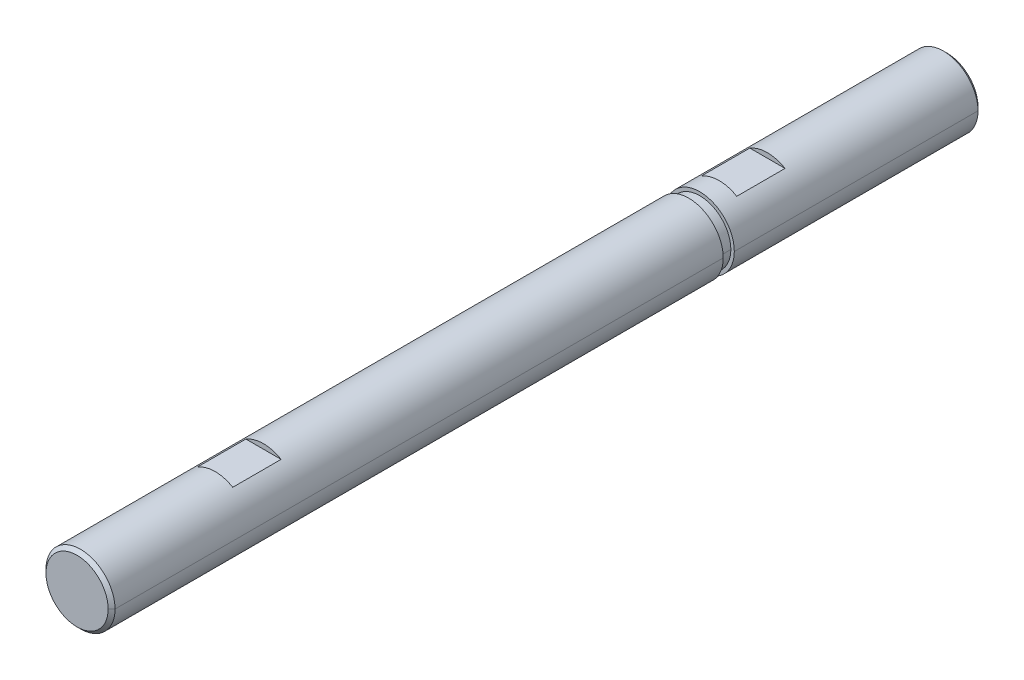
ISO-10303-21;
HEADER;
FILE_DESCRIPTION(('STEP AP214'),'2;1');
FILE_NAME('part.step','',(''),(''),'','','');
FILE_SCHEMA(('AUTOMOTIVE_DESIGN { 1 0 10303 214 1 1 1 1 }'));
ENDSEC;
DATA;
#1=APPLICATION_CONTEXT('core data for automotive mechanical design processes');
#2=APPLICATION_PROTOCOL_DEFINITION('international standard','automotive_design',2000,#1);
#3=PRODUCT_CONTEXT('',#1,'mechanical');
#4=PRODUCT('Part','Part','',(#3));
#5=PRODUCT_RELATED_PRODUCT_CATEGORY('part','',(#4));
#6=PRODUCT_DEFINITION_FORMATION('','',#4);
#7=PRODUCT_DEFINITION_CONTEXT('part definition',#1,'design');
#8=PRODUCT_DEFINITION('design','',#6,#7);
#9=PRODUCT_DEFINITION_SHAPE('','',#8);
#10=(LENGTH_UNIT() NAMED_UNIT(*) SI_UNIT(.MILLI.,.METRE.));
#11=(NAMED_UNIT(*) PLANE_ANGLE_UNIT() SI_UNIT($,.RADIAN.));
#12=(NAMED_UNIT(*) SI_UNIT($,.STERADIAN.) SOLID_ANGLE_UNIT());
#13=UNCERTAINTY_MEASURE_WITH_UNIT(LENGTH_MEASURE(1.E-05),#10,'distance_accuracy_value','');
#14=(GEOMETRIC_REPRESENTATION_CONTEXT(3) GLOBAL_UNCERTAINTY_ASSIGNED_CONTEXT((#13)) GLOBAL_UNIT_ASSIGNED_CONTEXT((#10,
#11,#12)) REPRESENTATION_CONTEXT('',''));
#15=CARTESIAN_POINT('',(0.,0.,0.));
#16=DIRECTION('',(0.,0.,1.));
#17=DIRECTION('',(1.,0.,0.));
#18=AXIS2_PLACEMENT_3D('',#15,#16,#17);
#19=CARTESIAN_POINT('',(0.,0.,63.));
#20=DIRECTION('',(0.,0.,-1.));
#21=DIRECTION('',(-1.,0.,0.));
#22=AXIS2_PLACEMENT_3D('',#19,#20,#21);
#23=CYLINDRICAL_SURFACE('',#22,2.5);
#24=DIRECTION('',(0.,0.,-1.));
#25=VECTOR('',#24,1.);
#26=CARTESIAN_POINT('',(2.5,0.,63.));
#27=LINE('',#26,#25);
#28=CARTESIAN_POINT('',(2.5,0.,17.9));
#29=VERTEX_POINT('',#28);
#30=CARTESIAN_POINT('',(2.5,0.,0.25));
#31=VERTEX_POINT('',#30);
#32=EDGE_CURVE('E210',#29,#31,#27,.T.);
#33=ORIENTED_EDGE('',*,*,#32,.F.);
#34=CARTESIAN_POINT('',(0.,0.,17.9));
#35=DIRECTION('',(0.,0.,-1.));
#36=DIRECTION('',(-1.,0.,0.));
#37=AXIS2_PLACEMENT_3D('',#34,#35,#36);
#38=CIRCLE('',#37,2.5);
#39=CARTESIAN_POINT('',(-2.5,0.,17.9));
#40=VERTEX_POINT('',#39);
#41=EDGE_CURVE('E137',#29,#40,#38,.T.);
#42=ORIENTED_EDGE('',*,*,#41,.T.);
#43=DIRECTION('',(0.,0.,-1.));
#44=VECTOR('',#43,1.);
#45=CARTESIAN_POINT('',(-2.5,0.,63.));
#46=LINE('',#45,#44);
#47=CARTESIAN_POINT('',(-2.5,0.,0.25));
#48=VERTEX_POINT('',#47);
#49=EDGE_CURVE('E231',#40,#48,#46,.T.);
#50=ORIENTED_EDGE('',*,*,#49,.T.);
#51=CARTESIAN_POINT('',(0.,0.,0.25));
#52=DIRECTION('',(0.,0.,1.));
#53=DIRECTION('',(1.,0.,0.));
#54=AXIS2_PLACEMENT_3D('',#51,#52,#53);
#55=CIRCLE('',#54,2.5);
#56=EDGE_CURVE('E161',#48,#31,#55,.T.);
#57=ORIENTED_EDGE('',*,*,#56,.T.);
#58=EDGE_LOOP('',(#33,#42,#50,#57));
#59=FACE_BOUND('',#58,.T.);
#60=ADVANCED_FACE('F17',(#59),#23,.T.);
#61=CARTESIAN_POINT('',(-2.,3.69848883343288,16.5));
#62=DIRECTION('',(0.,0.,1.));
#63=DIRECTION('',(1.,0.,0.));
#64=AXIS2_PLACEMENT_3D('',#61,#62,#63);
#65=PLANE('',#64);
#66=DIRECTION('',(1.,0.,0.));
#67=VECTOR('',#66,1.);
#68=CARTESIAN_POINT('',(-2.,2.15,16.5));
#69=LINE('',#68,#67);
#70=CARTESIAN_POINT('',(-1.27573508221731,2.15,16.5));
#71=VERTEX_POINT('',#70);
#72=CARTESIAN_POINT('',(1.27573508221731,2.15,16.5));
#73=VERTEX_POINT('',#72);
#74=EDGE_CURVE('E11',#71,#73,#69,.T.);
#75=ORIENTED_EDGE('',*,*,#74,.F.);
#76=CARTESIAN_POINT('',(0.,0.,16.5));
#77=DIRECTION('',(0.,0.,1.));
#78=DIRECTION('',(1.,0.,0.));
#79=AXIS2_PLACEMENT_3D('',#76,#77,#78);
#80=CIRCLE('',#79,2.5);
#81=EDGE_CURVE('E200',#73,#71,#80,.T.);
#82=ORIENTED_EDGE('',*,*,#81,.F.);
#83=EDGE_LOOP('',(#75,#82));
#84=FACE_BOUND('',#83,.T.);
#85=ADVANCED_FACE('F474',(#84),#65,.F.);
#86=CARTESIAN_POINT('',(-2.,2.15,16.5));
#87=DIRECTION('',(0.,-1.,0.));
#88=DIRECTION('',(0.,0.,-1.));
#89=AXIS2_PLACEMENT_3D('',#86,#87,#88);
#90=PLANE('',#89);
#91=ORIENTED_EDGE('',*,*,#74,.T.);
#92=DIRECTION('',(0.,0.,1.));
#93=VECTOR('',#92,1.);
#94=CARTESIAN_POINT('',(1.27573508221731,2.15,63.));
#95=LINE('',#94,#93);
#96=CARTESIAN_POINT('',(1.27573508221731,2.15,13.));
#97=VERTEX_POINT('',#96);
#98=EDGE_CURVE('E191',#97,#73,#95,.T.);
#99=ORIENTED_EDGE('',*,*,#98,.F.);
#100=DIRECTION('',(1.,0.,0.));
#101=VECTOR('',#100,1.);
#102=CARTESIAN_POINT('',(-2.,2.15,13.));
#103=LINE('',#102,#101);
#104=CARTESIAN_POINT('',(-1.27573508221731,2.15,13.));
#105=VERTEX_POINT('',#104);
#106=EDGE_CURVE('E27',#105,#97,#103,.T.);
#107=ORIENTED_EDGE('',*,*,#106,.F.);
#108=DIRECTION('',(0.,0.,-1.));
#109=VECTOR('',#108,1.);
#110=CARTESIAN_POINT('',(-1.27573508221731,2.15,63.));
#111=LINE('',#110,#109);
#112=EDGE_CURVE('E192',#71,#105,#111,.T.);
#113=ORIENTED_EDGE('',*,*,#112,.F.);
#114=EDGE_LOOP('',(#91,#99,#107,#113));
#115=FACE_BOUND('',#114,.T.);
#116=ADVANCED_FACE('F465',(#115),#90,.F.);
#117=CARTESIAN_POINT('',(-2.,3.69848883343288,13.));
#118=DIRECTION('',(0.,0.,-1.));
#119=DIRECTION('',(0.,-1.,0.));
#120=AXIS2_PLACEMENT_3D('',#117,#118,#119);
#121=PLANE('',#120);
#122=ORIENTED_EDGE('',*,*,#106,.T.);
#123=CARTESIAN_POINT('',(0.,0.,13.));
#124=DIRECTION('',(0.,0.,-1.));
#125=DIRECTION('',(-1.,0.,0.));
#126=AXIS2_PLACEMENT_3D('',#123,#124,#125);
#127=CIRCLE('',#126,2.5);
#128=EDGE_CURVE('E187',#105,#97,#127,.T.);
#129=ORIENTED_EDGE('',*,*,#128,.F.);
#130=EDGE_LOOP('',(#122,#129));
#131=FACE_BOUND('',#130,.T.);
#132=ADVANCED_FACE('F461',(#131),#121,.F.);
#133=CARTESIAN_POINT('',(0.,0.,0.25));
#134=DIRECTION('',(0.,0.,1.));
#135=DIRECTION('',(1.,0.,0.));
#136=AXIS2_PLACEMENT_3D('',#133,#134,#135);
#137=CONICAL_SURFACE('',#136,2.5,0.785398163397443);
#138=DIRECTION('',(-0.707106781186545,0.,0.707106781186551));
#139=VECTOR('',#138,1.);
#140=CARTESIAN_POINT('',(-2.5,0.,0.25));
#141=LINE('',#140,#139);
#142=CARTESIAN_POINT('',(-2.25,0.,0.));
#143=VERTEX_POINT('',#142);
#144=EDGE_CURVE('E157',#143,#48,#141,.T.);
#145=ORIENTED_EDGE('',*,*,#144,.F.);
#146=CARTESIAN_POINT('',(0.,0.,0.));
#147=DIRECTION('',(0.,0.,-1.));
#148=DIRECTION('',(1.,0.,0.));
#149=AXIS2_PLACEMENT_3D('',#146,#147,#148);
#150=CIRCLE('',#149,2.25);
#151=CARTESIAN_POINT('',(2.25,0.,0.));
#152=VERTEX_POINT('',#151);
#153=EDGE_CURVE('E232',#152,#143,#150,.T.);
#154=ORIENTED_EDGE('',*,*,#153,.F.);
#155=DIRECTION('',(0.707106781186545,0.,0.707106781186551));
#156=VECTOR('',#155,1.);
#157=CARTESIAN_POINT('',(2.5,0.,0.25));
#158=LINE('',#157,#156);
#159=EDGE_CURVE('E150',#152,#31,#158,.T.);
#160=ORIENTED_EDGE('',*,*,#159,.T.);
#161=ORIENTED_EDGE('',*,*,#56,.F.);
#162=EDGE_LOOP('',(#145,#154,#160,#161));
#163=FACE_BOUND('',#162,.T.);
#164=ADVANCED_FACE('F455',(#163),#137,.T.);
#165=CARTESIAN_POINT('',(0.,0.,0.));
#166=DIRECTION('',(0.,0.,1.));
#167=DIRECTION('',(1.,0.,0.));
#168=AXIS2_PLACEMENT_3D('',#165,#166,#167);
#169=PLANE('',#168);
#170=ORIENTED_EDGE('',*,*,#153,.T.);
#171=CARTESIAN_POINT('',(0.,0.,0.));
#172=DIRECTION('',(0.,0.,-1.));
#173=DIRECTION('',(1.,0.,0.));
#174=AXIS2_PLACEMENT_3D('',#171,#172,#173);
#175=CIRCLE('',#174,2.25);
#176=EDGE_CURVE('E220',#143,#152,#175,.T.);
#177=ORIENTED_EDGE('',*,*,#176,.T.);
#178=EDGE_LOOP('',(#170,#177));
#179=FACE_BOUND('',#178,.T.);
#180=ADVANCED_FACE('F430',(#179),#169,.F.);
#181=CARTESIAN_POINT('',(0.,0.,-3.15));
#182=DIRECTION('',(0.,0.,-1.));
#183=DIRECTION('',(-1.,0.,0.));
#184=AXIS2_PLACEMENT_3D('',#181,#182,#183);
#185=CYLINDRICAL_SURFACE('',#184,2.25);
#186=DIRECTION('',(0.,0.,-1.));
#187=VECTOR('',#186,1.);
#188=CARTESIAN_POINT('',(2.25,0.,-3.15));
#189=LINE('',#188,#187);
#190=CARTESIAN_POINT('',(2.25,0.,18.7));
#191=VERTEX_POINT('',#190);
#192=CARTESIAN_POINT('',(2.25,0.,17.9));
#193=VERTEX_POINT('',#192);
#194=EDGE_CURVE('E140',#191,#193,#189,.T.);
#195=ORIENTED_EDGE('',*,*,#194,.F.);
#196=CARTESIAN_POINT('',(0.,0.,18.7));
#197=DIRECTION('',(0.,0.,-1.));
#198=DIRECTION('',(-1.,0.,0.));
#199=AXIS2_PLACEMENT_3D('',#196,#197,#198);
#200=CIRCLE('',#199,2.25);
#201=CARTESIAN_POINT('',(-2.25,0.,18.7));
#202=VERTEX_POINT('',#201);
#203=EDGE_CURVE('E128',#191,#202,#200,.T.);
#204=ORIENTED_EDGE('',*,*,#203,.T.);
#205=DIRECTION('',(0.,0.,-1.));
#206=VECTOR('',#205,1.);
#207=CARTESIAN_POINT('',(-2.25,0.,-3.15));
#208=LINE('',#207,#206);
#209=CARTESIAN_POINT('',(-2.25,0.,17.9));
#210=VERTEX_POINT('',#209);
#211=EDGE_CURVE('E148',#202,#210,#208,.T.);
#212=ORIENTED_EDGE('',*,*,#211,.T.);
#213=CARTESIAN_POINT('',(0.,0.,17.9));
#214=DIRECTION('',(0.,0.,-1.));
#215=DIRECTION('',(-1.,0.,0.));
#216=AXIS2_PLACEMENT_3D('',#213,#214,#215);
#217=CIRCLE('',#216,2.25);
#218=EDGE_CURVE('E116',#193,#210,#217,.T.);
#219=ORIENTED_EDGE('',*,*,#218,.F.);
#220=EDGE_LOOP('',(#195,#204,#212,#219));
#221=FACE_BOUND('',#220,.T.);
#222=ADVANCED_FACE('F141',(#221),#185,.T.);
#223=CARTESIAN_POINT('',(0.,3.36602600753544,17.9));
#224=DIRECTION('',(0.,0.,-1.));
#225=DIRECTION('',(0.,-1.,0.));
#226=AXIS2_PLACEMENT_3D('',#223,#224,#225);
#227=PLANE('',#226);
#228=CARTESIAN_POINT('',(0.,0.,17.9));
#229=DIRECTION('',(0.,0.,-1.));
#230=DIRECTION('',(-1.,0.,0.));
#231=AXIS2_PLACEMENT_3D('',#228,#229,#230);
#232=CIRCLE('',#231,2.25);
#233=EDGE_CURVE('E145',#210,#193,#232,.T.);
#234=ORIENTED_EDGE('',*,*,#233,.T.);
#235=ORIENTED_EDGE('',*,*,#218,.T.);
#236=EDGE_LOOP('',(#234,#235));
#237=FACE_BOUND('',#236,.T.);
#238=CARTESIAN_POINT('',(0.,0.,17.9));
#239=DIRECTION('',(0.,0.,-1.));
#240=DIRECTION('',(-1.,0.,0.));
#241=AXIS2_PLACEMENT_3D('',#238,#239,#240);
#242=CIRCLE('',#241,2.5);
#243=EDGE_CURVE('E206',#40,#29,#242,.T.);
#244=ORIENTED_EDGE('',*,*,#243,.F.);
#245=ORIENTED_EDGE('',*,*,#41,.F.);
#246=EDGE_LOOP('',(#244,#245));
#247=FACE_BOUND('',#246,.T.);
#248=ADVANCED_FACE('F429',(#237,#247),#227,.F.);
#249=CARTESIAN_POINT('',(0.,3.36602600753544,18.7));
#250=DIRECTION('',(0.,0.,1.));
#251=DIRECTION('',(1.,0.,0.));
#252=AXIS2_PLACEMENT_3D('',#249,#250,#251);
#253=PLANE('',#252);
#254=CARTESIAN_POINT('',(0.,0.,18.7));
#255=DIRECTION('',(0.,0.,-1.));
#256=DIRECTION('',(-1.,0.,0.));
#257=AXIS2_PLACEMENT_3D('',#254,#255,#256);
#258=CIRCLE('',#257,2.25);
#259=EDGE_CURVE('E133',#202,#191,#258,.T.);
#260=ORIENTED_EDGE('',*,*,#259,.F.);
#261=ORIENTED_EDGE('',*,*,#203,.F.);
#262=EDGE_LOOP('',(#260,#261));
#263=FACE_BOUND('',#262,.T.);
#264=CARTESIAN_POINT('',(0.,0.,18.7));
#265=DIRECTION('',(0.,0.,1.));
#266=DIRECTION('',(1.,0.,0.));
#267=AXIS2_PLACEMENT_3D('',#264,#265,#266);
#268=CIRCLE('',#267,2.5);
#269=CARTESIAN_POINT('',(-2.5,0.,18.7));
#270=VERTEX_POINT('',#269);
#271=CARTESIAN_POINT('',(2.5,0.,18.7));
#272=VERTEX_POINT('',#271);
#273=EDGE_CURVE('E227',#270,#272,#268,.T.);
#274=ORIENTED_EDGE('',*,*,#273,.F.);
#275=CARTESIAN_POINT('',(0.,0.,18.7));
#276=DIRECTION('',(0.,0.,1.));
#277=DIRECTION('',(1.,0.,0.));
#278=AXIS2_PLACEMENT_3D('',#275,#276,#277);
#279=CIRCLE('',#278,2.5);
#280=EDGE_CURVE('E168',#272,#270,#279,.T.);
#281=ORIENTED_EDGE('',*,*,#280,.F.);
#282=EDGE_LOOP('',(#274,#281));
#283=FACE_BOUND('',#282,.T.);
#284=ADVANCED_FACE('F130',(#263,#283),#253,.F.);
#285=CARTESIAN_POINT('',(-2.,2.15,53.));
#286=DIRECTION('',(0.,-1.,0.));
#287=DIRECTION('',(0.,0.,-1.));
#288=AXIS2_PLACEMENT_3D('',#285,#286,#287);
#289=PLANE('',#288);
#290=DIRECTION('',(1.,0.,0.));
#291=VECTOR('',#290,1.);
#292=CARTESIAN_POINT('',(-2.,2.15,53.));
#293=LINE('',#292,#291);
#294=CARTESIAN_POINT('',(-1.27573508221731,2.15,53.));
#295=VERTEX_POINT('',#294);
#296=CARTESIAN_POINT('',(1.27573508221731,2.15,53.));
#297=VERTEX_POINT('',#296);
#298=EDGE_CURVE('E193',#295,#297,#293,.T.);
#299=ORIENTED_EDGE('',*,*,#298,.T.);
#300=DIRECTION('',(0.,0.,1.));
#301=VECTOR('',#300,1.);
#302=CARTESIAN_POINT('',(1.27573508221731,2.15,63.));
#303=LINE('',#302,#301);
#304=CARTESIAN_POINT('',(1.27573508221731,2.15,49.5));
#305=VERTEX_POINT('',#304);
#306=EDGE_CURVE('E173',#305,#297,#303,.T.);
#307=ORIENTED_EDGE('',*,*,#306,.F.);
#308=DIRECTION('',(1.,0.,0.));
#309=VECTOR('',#308,1.);
#310=CARTESIAN_POINT('',(-2.,2.15,49.5));
#311=LINE('',#310,#309);
#312=CARTESIAN_POINT('',(-1.27573508221731,2.15,49.5));
#313=VERTEX_POINT('',#312);
#314=EDGE_CURVE('E39',#313,#305,#311,.T.);
#315=ORIENTED_EDGE('',*,*,#314,.F.);
#316=DIRECTION('',(0.,0.,-1.));
#317=VECTOR('',#316,1.);
#318=CARTESIAN_POINT('',(-1.27573508221731,2.15,63.));
#319=LINE('',#318,#317);
#320=EDGE_CURVE('E174',#295,#313,#319,.T.);
#321=ORIENTED_EDGE('',*,*,#320,.F.);
#322=EDGE_LOOP('',(#299,#307,#315,#321));
#323=FACE_BOUND('',#322,.T.);
#324=ADVANCED_FACE('F416',(#323),#289,.F.);
#325=CARTESIAN_POINT('',(-2.,3.69848883343289,49.5));
#326=DIRECTION('',(0.,0.,-1.));
#327=DIRECTION('',(0.,-1.,0.));
#328=AXIS2_PLACEMENT_3D('',#325,#326,#327);
#329=PLANE('',#328);
#330=ORIENTED_EDGE('',*,*,#314,.T.);
#331=CARTESIAN_POINT('',(0.,0.,49.5));
#332=DIRECTION('',(0.,0.,-1.));
#333=DIRECTION('',(-1.,0.,0.));
#334=AXIS2_PLACEMENT_3D('',#331,#332,#333);
#335=CIRCLE('',#334,2.5);
#336=EDGE_CURVE('E169',#313,#305,#335,.T.);
#337=ORIENTED_EDGE('',*,*,#336,.F.);
#338=EDGE_LOOP('',(#330,#337));
#339=FACE_BOUND('',#338,.T.);
#340=ADVANCED_FACE('F420',(#339),#329,.F.);
#341=CARTESIAN_POINT('',(-2.,3.69848883343289,53.));
#342=DIRECTION('',(0.,0.,1.));
#343=DIRECTION('',(1.,0.,0.));
#344=AXIS2_PLACEMENT_3D('',#341,#342,#343);
#345=PLANE('',#344);
#346=ORIENTED_EDGE('',*,*,#298,.F.);
#347=CARTESIAN_POINT('',(0.,0.,53.));
#348=DIRECTION('',(0.,0.,1.));
#349=DIRECTION('',(1.,0.,0.));
#350=AXIS2_PLACEMENT_3D('',#347,#348,#349);
#351=CIRCLE('',#350,2.5);
#352=EDGE_CURVE('E167',#297,#295,#351,.T.);
#353=ORIENTED_EDGE('',*,*,#352,.F.);
#354=EDGE_LOOP('',(#346,#353));
#355=FACE_BOUND('',#354,.T.);
#356=ADVANCED_FACE('F435',(#355),#345,.F.);
#357=CARTESIAN_POINT('',(0.,0.,63.));
#358=DIRECTION('',(0.,0.,-1.));
#359=DIRECTION('',(-1.,0.,0.));
#360=AXIS2_PLACEMENT_3D('',#357,#358,#359);
#361=CONICAL_SURFACE('',#360,2.25,0.785398163397472);
#362=DIRECTION('',(0.707106781186564,0.,-0.707106781186531));
#363=VECTOR('',#362,1.);
#364=CARTESIAN_POINT('',(2.25,0.,63.));
#365=LINE('',#364,#363);
#366=CARTESIAN_POINT('',(2.25,0.,63.));
#367=VERTEX_POINT('',#366);
#368=CARTESIAN_POINT('',(2.5,0.,62.75));
#369=VERTEX_POINT('',#368);
#370=EDGE_CURVE('E216',#367,#369,#365,.T.);
#371=ORIENTED_EDGE('',*,*,#370,.F.);
#372=CARTESIAN_POINT('',(0.,0.,63.));
#373=DIRECTION('',(0.,0.,1.));
#374=DIRECTION('',(1.,0.,0.));
#375=AXIS2_PLACEMENT_3D('',#372,#373,#374);
#376=CIRCLE('',#375,2.25);
#377=CARTESIAN_POINT('',(-2.25,0.,63.));
#378=VERTEX_POINT('',#377);
#379=EDGE_CURVE('E105',#378,#367,#376,.T.);
#380=ORIENTED_EDGE('',*,*,#379,.F.);
#381=DIRECTION('',(-0.707106781186564,0.,-0.707106781186531));
#382=VECTOR('',#381,1.);
#383=CARTESIAN_POINT('',(-2.25,0.,63.));
#384=LINE('',#383,#382);
#385=CARTESIAN_POINT('',(-2.5,0.,62.75));
#386=VERTEX_POINT('',#385);
#387=EDGE_CURVE('E215',#378,#386,#384,.T.);
#388=ORIENTED_EDGE('',*,*,#387,.T.);
#389=CARTESIAN_POINT('',(0.,0.,62.75));
#390=DIRECTION('',(0.,0.,-1.));
#391=DIRECTION('',(1.,0.,0.));
#392=AXIS2_PLACEMENT_3D('',#389,#390,#391);
#393=CIRCLE('',#392,2.5);
#394=EDGE_CURVE('E224',#369,#386,#393,.T.);
#395=ORIENTED_EDGE('',*,*,#394,.F.);
#396=EDGE_LOOP('',(#371,#380,#388,#395));
#397=FACE_BOUND('',#396,.T.);
#398=ADVANCED_FACE('F439',(#397),#361,.T.);
#399=CARTESIAN_POINT('',(0.,0.,63.));
#400=DIRECTION('',(0.,0.,1.));
#401=DIRECTION('',(1.,0.,0.));
#402=AXIS2_PLACEMENT_3D('',#399,#400,#401);
#403=PLANE('',#402);
#404=ORIENTED_EDGE('',*,*,#379,.T.);
#405=CARTESIAN_POINT('',(0.,0.,63.));
#406=DIRECTION('',(0.,0.,1.));
#407=DIRECTION('',(1.,0.,0.));
#408=AXIS2_PLACEMENT_3D('',#405,#406,#407);
#409=CIRCLE('',#408,2.25);
#410=EDGE_CURVE('E205',#367,#378,#409,.T.);
#411=ORIENTED_EDGE('',*,*,#410,.T.);
#412=EDGE_LOOP('',(#404,#411));
#413=FACE_BOUND('',#412,.T.);
#414=ADVANCED_FACE('F410',(#413),#403,.T.);
#415=CARTESIAN_POINT('',(0.,0.,63.));
#416=DIRECTION('',(0.,0.,-1.));
#417=DIRECTION('',(-1.,0.,0.));
#418=AXIS2_PLACEMENT_3D('',#415,#416,#417);
#419=CYLINDRICAL_SURFACE('',#418,2.5);
#420=DIRECTION('',(0.,0.,-1.));
#421=VECTOR('',#420,1.);
#422=CARTESIAN_POINT('',(2.5,0.,63.));
#423=LINE('',#422,#421);
#424=EDGE_CURVE('E183',#369,#272,#423,.T.);
#425=ORIENTED_EDGE('',*,*,#424,.F.);
#426=ORIENTED_EDGE('',*,*,#394,.T.);
#427=DIRECTION('',(0.,0.,-1.));
#428=VECTOR('',#427,1.);
#429=CARTESIAN_POINT('',(-2.5,0.,63.));
#430=LINE('',#429,#428);
#431=EDGE_CURVE('E163',#386,#270,#430,.T.);
#432=ORIENTED_EDGE('',*,*,#431,.T.);
#433=ORIENTED_EDGE('',*,*,#273,.T.);
#434=EDGE_LOOP('',(#425,#426,#432,#433));
#435=FACE_BOUND('',#434,.T.);
#436=ADVANCED_FACE('F405',(#435),#419,.T.);
#437=CARTESIAN_POINT('',(0.,0.,63.));
#438=DIRECTION('',(0.,0.,-1.));
#439=DIRECTION('',(-1.,0.,0.));
#440=AXIS2_PLACEMENT_3D('',#437,#438,#439);
#441=CYLINDRICAL_SURFACE('',#440,2.5);
#442=ORIENTED_EDGE('',*,*,#352,.T.);
#443=ORIENTED_EDGE('',*,*,#320,.T.);
#444=ORIENTED_EDGE('',*,*,#336,.T.);
#445=ORIENTED_EDGE('',*,*,#306,.T.);
#446=EDGE_LOOP('',(#442,#443,#444,#445));
#447=FACE_BOUND('',#446,.T.);
#448=CARTESIAN_POINT('',(0.,0.,62.75));
#449=DIRECTION('',(0.,0.,-1.));
#450=DIRECTION('',(1.,0.,0.));
#451=AXIS2_PLACEMENT_3D('',#448,#449,#450);
#452=CIRCLE('',#451,2.5);
#453=EDGE_CURVE('E211',#386,#369,#452,.T.);
#454=ORIENTED_EDGE('',*,*,#453,.T.);
#455=ORIENTED_EDGE('',*,*,#424,.T.);
#456=ORIENTED_EDGE('',*,*,#280,.T.);
#457=ORIENTED_EDGE('',*,*,#431,.F.);
#458=EDGE_LOOP('',(#454,#455,#456,#457));
#459=FACE_BOUND('',#458,.T.);
#460=ADVANCED_FACE('F409',(#447,#459),#441,.T.);
#461=CARTESIAN_POINT('',(0.,0.,63.));
#462=DIRECTION('',(0.,0.,-1.));
#463=DIRECTION('',(-1.,0.,0.));
#464=AXIS2_PLACEMENT_3D('',#461,#462,#463);
#465=CONICAL_SURFACE('',#464,2.25,0.785398163397472);
#466=ORIENTED_EDGE('',*,*,#410,.F.);
#467=ORIENTED_EDGE('',*,*,#370,.T.);
#468=ORIENTED_EDGE('',*,*,#453,.F.);
#469=ORIENTED_EDGE('',*,*,#387,.F.);
#470=EDGE_LOOP('',(#466,#467,#468,#469));
#471=FACE_BOUND('',#470,.T.);
#472=ADVANCED_FACE('F19',(#471),#465,.T.);
#473=CARTESIAN_POINT('',(0.,0.,-3.15));
#474=DIRECTION('',(0.,0.,-1.));
#475=DIRECTION('',(-1.,0.,0.));
#476=AXIS2_PLACEMENT_3D('',#473,#474,#475);
#477=CYLINDRICAL_SURFACE('',#476,2.25);
#478=ORIENTED_EDGE('',*,*,#259,.T.);
#479=ORIENTED_EDGE('',*,*,#194,.T.);
#480=ORIENTED_EDGE('',*,*,#233,.F.);
#481=ORIENTED_EDGE('',*,*,#211,.F.);
#482=EDGE_LOOP('',(#478,#479,#480,#481));
#483=FACE_BOUND('',#482,.T.);
#484=ADVANCED_FACE('F147',(#483),#477,.T.);
#485=CARTESIAN_POINT('',(0.,0.,0.25));
#486=DIRECTION('',(0.,0.,1.));
#487=DIRECTION('',(1.,0.,0.));
#488=AXIS2_PLACEMENT_3D('',#485,#486,#487);
#489=CONICAL_SURFACE('',#488,2.5,0.785398163397443);
#490=ORIENTED_EDGE('',*,*,#176,.F.);
#491=ORIENTED_EDGE('',*,*,#144,.T.);
#492=CARTESIAN_POINT('',(0.,0.,0.25));
#493=DIRECTION('',(0.,0.,1.));
#494=DIRECTION('',(1.,0.,0.));
#495=AXIS2_PLACEMENT_3D('',#492,#493,#494);
#496=CIRCLE('',#495,2.5);
#497=EDGE_CURVE('E241',#31,#48,#496,.T.);
#498=ORIENTED_EDGE('',*,*,#497,.F.);
#499=ORIENTED_EDGE('',*,*,#159,.F.);
#500=EDGE_LOOP('',(#490,#491,#498,#499));
#501=FACE_BOUND('',#500,.T.);
#502=ADVANCED_FACE('F491',(#501),#489,.T.);
#503=CARTESIAN_POINT('',(0.,0.,63.));
#504=DIRECTION('',(0.,0.,-1.));
#505=DIRECTION('',(-1.,0.,0.));
#506=AXIS2_PLACEMENT_3D('',#503,#504,#505);
#507=CYLINDRICAL_SURFACE('',#506,2.5);
#508=ORIENTED_EDGE('',*,*,#81,.T.);
#509=ORIENTED_EDGE('',*,*,#112,.T.);
#510=ORIENTED_EDGE('',*,*,#128,.T.);
#511=ORIENTED_EDGE('',*,*,#98,.T.);
#512=EDGE_LOOP('',(#508,#509,#510,#511));
#513=FACE_BOUND('',#512,.T.);
#514=ORIENTED_EDGE('',*,*,#243,.T.);
#515=ORIENTED_EDGE('',*,*,#32,.T.);
#516=ORIENTED_EDGE('',*,*,#497,.T.);
#517=ORIENTED_EDGE('',*,*,#49,.F.);
#518=EDGE_LOOP('',(#514,#515,#516,#517));
#519=FACE_BOUND('',#518,.T.);
#520=ADVANCED_FACE('F519',(#513,#519),#507,.T.);
#521=CLOSED_SHELL('',(#60,#85,#116,#132,#164,#180,#222,#248,#284,#324,#340,#356,#398,#414,#436,
#460,#472,#484,#502,#520));
#522=MANIFOLD_SOLID_BREP('B1',#521);
#523=ADVANCED_BREP_SHAPE_REPRESENTATION('',(#18,#522),#14);
#524=SHAPE_DEFINITION_REPRESENTATION(#9,#523);
ENDSEC;
END-ISO-10303-21;
